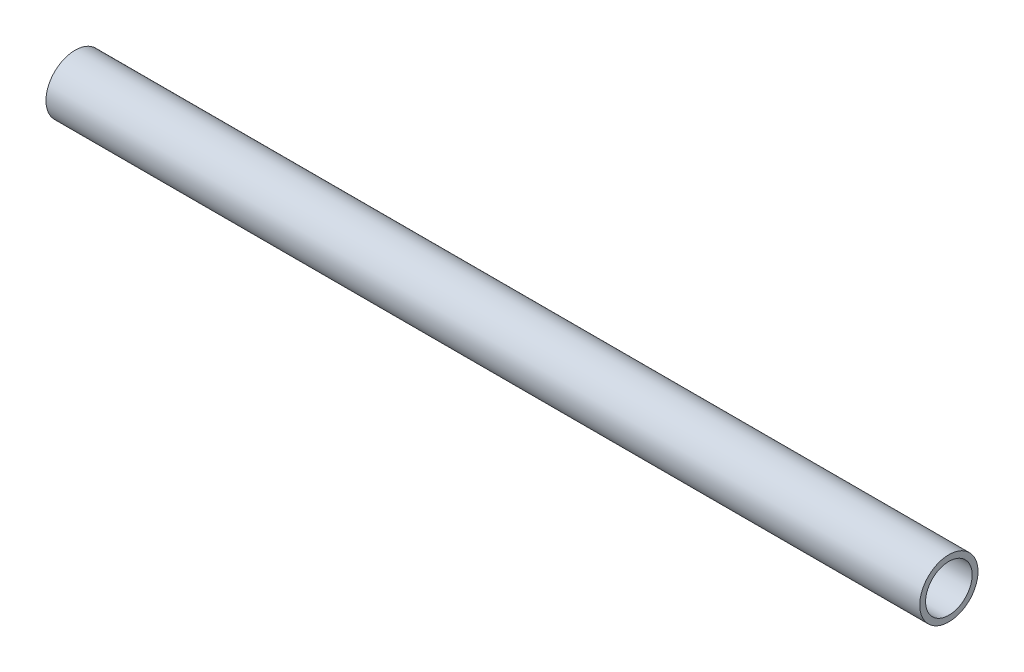
ISO-10303-21;
HEADER;
FILE_DESCRIPTION(('STEP AP214'),'2;1');
FILE_NAME('part.step','',(''),(''),'','','');
FILE_SCHEMA(('AUTOMOTIVE_DESIGN { 1 0 10303 214 1 1 1 1 }'));
ENDSEC;
DATA;
#1=APPLICATION_CONTEXT('core data for automotive mechanical design processes');
#2=APPLICATION_PROTOCOL_DEFINITION('international standard','automotive_design',2000,#1);
#3=PRODUCT_CONTEXT('',#1,'mechanical');
#4=PRODUCT('Part','Part','',(#3));
#5=PRODUCT_RELATED_PRODUCT_CATEGORY('part','',(#4));
#6=PRODUCT_DEFINITION_FORMATION('','',#4);
#7=PRODUCT_DEFINITION_CONTEXT('part definition',#1,'design');
#8=PRODUCT_DEFINITION('design','',#6,#7);
#9=PRODUCT_DEFINITION_SHAPE('','',#8);
#10=(LENGTH_UNIT() NAMED_UNIT(*) SI_UNIT(.MILLI.,.METRE.));
#11=(NAMED_UNIT(*) PLANE_ANGLE_UNIT() SI_UNIT($,.RADIAN.));
#12=(NAMED_UNIT(*) SI_UNIT($,.STERADIAN.) SOLID_ANGLE_UNIT());
#13=UNCERTAINTY_MEASURE_WITH_UNIT(LENGTH_MEASURE(1.E-05),#10,'distance_accuracy_value','');
#14=(GEOMETRIC_REPRESENTATION_CONTEXT(3) GLOBAL_UNCERTAINTY_ASSIGNED_CONTEXT((#13)) GLOBAL_UNIT_ASSIGNED_CONTEXT((#10,
#11,#12)) REPRESENTATION_CONTEXT('',''));
#15=CARTESIAN_POINT('',(0.,0.,0.));
#16=DIRECTION('',(0.,0.,1.));
#17=DIRECTION('',(1.,0.,0.));
#18=AXIS2_PLACEMENT_3D('',#15,#16,#17);
#19=CARTESIAN_POINT('',(300.,0.,0.));
#20=DIRECTION('',(1.,0.,0.));
#21=DIRECTION('',(0.,0.,-1.));
#22=AXIS2_PLACEMENT_3D('',#19,#20,#21);
#23=PLANE('',#22);
#24=CARTESIAN_POINT('',(300.,0.,0.));
#25=DIRECTION('',(1.,0.,0.));
#26=DIRECTION('',(0.,0.,-1.));
#27=AXIS2_PLACEMENT_3D('',#24,#25,#26);
#28=CIRCLE('',#27,10.);
#29=CARTESIAN_POINT('',(300.,0.,-10.));
#30=VERTEX_POINT('',#29);
#31=EDGE_CURVE('E10',#30,#30,#28,.T.);
#32=ORIENTED_EDGE('',*,*,#31,.T.);
#33=EDGE_LOOP('',(#32));
#34=FACE_BOUND('',#33,.T.);
#35=CARTESIAN_POINT('',(300.,0.,0.));
#36=DIRECTION('',(1.,0.,0.));
#37=DIRECTION('',(0.,0.,-1.));
#38=AXIS2_PLACEMENT_3D('',#35,#36,#37);
#39=CIRCLE('',#38,8.);
#40=CARTESIAN_POINT('',(300.,0.,-8.));
#41=VERTEX_POINT('',#40);
#42=EDGE_CURVE('E54',#41,#41,#39,.T.);
#43=ORIENTED_EDGE('',*,*,#42,.F.);
#44=EDGE_LOOP('',(#43));
#45=FACE_BOUND('',#44,.T.);
#46=ADVANCED_FACE('F41',(#34,#45),#23,.T.);
#47=CARTESIAN_POINT('',(0.,0.,0.));
#48=DIRECTION('',(1.,0.,0.));
#49=DIRECTION('',(0.,0.,-1.));
#50=AXIS2_PLACEMENT_3D('',#47,#48,#49);
#51=PLANE('',#50);
#52=CARTESIAN_POINT('',(0.,0.,0.));
#53=DIRECTION('',(1.,0.,0.));
#54=DIRECTION('',(0.,0.,-1.));
#55=AXIS2_PLACEMENT_3D('',#52,#53,#54);
#56=CIRCLE('',#55,10.);
#57=CARTESIAN_POINT('',(0.,0.,-10.));
#58=VERTEX_POINT('',#57);
#59=EDGE_CURVE('E45',#58,#58,#56,.T.);
#60=ORIENTED_EDGE('',*,*,#59,.F.);
#61=EDGE_LOOP('',(#60));
#62=FACE_BOUND('',#61,.T.);
#63=CARTESIAN_POINT('',(0.,0.,0.));
#64=DIRECTION('',(1.,0.,0.));
#65=DIRECTION('',(0.,0.,-1.));
#66=AXIS2_PLACEMENT_3D('',#63,#64,#65);
#67=CIRCLE('',#66,8.);
#68=CARTESIAN_POINT('',(0.,0.,-8.));
#69=VERTEX_POINT('',#68);
#70=EDGE_CURVE('E56',#69,#69,#67,.T.);
#71=ORIENTED_EDGE('',*,*,#70,.T.);
#72=EDGE_LOOP('',(#71));
#73=FACE_BOUND('',#72,.T.);
#74=ADVANCED_FACE('F68',(#62,#73),#51,.F.);
#75=CARTESIAN_POINT('',(300.,0.,0.));
#76=DIRECTION('',(-1.,0.,0.));
#77=DIRECTION('',(0.,0.,1.));
#78=AXIS2_PLACEMENT_3D('',#75,#76,#77);
#79=CYLINDRICAL_SURFACE('',#78,10.);
#80=ORIENTED_EDGE('',*,*,#31,.F.);
#81=EDGE_LOOP('',(#80));
#82=FACE_BOUND('',#81,.T.);
#83=ORIENTED_EDGE('',*,*,#59,.T.);
#84=EDGE_LOOP('',(#83));
#85=FACE_BOUND('',#84,.T.);
#86=ADVANCED_FACE('F43',(#82,#85),#79,.T.);
#87=CARTESIAN_POINT('',(300.,0.,0.));
#88=DIRECTION('',(-1.,0.,0.));
#89=DIRECTION('',(0.,0.,1.));
#90=AXIS2_PLACEMENT_3D('',#87,#88,#89);
#91=CYLINDRICAL_SURFACE('',#90,8.);
#92=ORIENTED_EDGE('',*,*,#42,.T.);
#93=EDGE_LOOP('',(#92));
#94=FACE_BOUND('',#93,.T.);
#95=ORIENTED_EDGE('',*,*,#70,.F.);
#96=EDGE_LOOP('',(#95));
#97=FACE_BOUND('',#96,.T.);
#98=ADVANCED_FACE('F64',(#94,#97),#91,.F.);
#99=CLOSED_SHELL('',(#46,#74,#86,#98));
#100=MANIFOLD_SOLID_BREP('B2',#99);
#101=ADVANCED_BREP_SHAPE_REPRESENTATION('',(#18,#100),#14);
#102=SHAPE_DEFINITION_REPRESENTATION(#9,#101);
ENDSEC;
END-ISO-10303-21;
